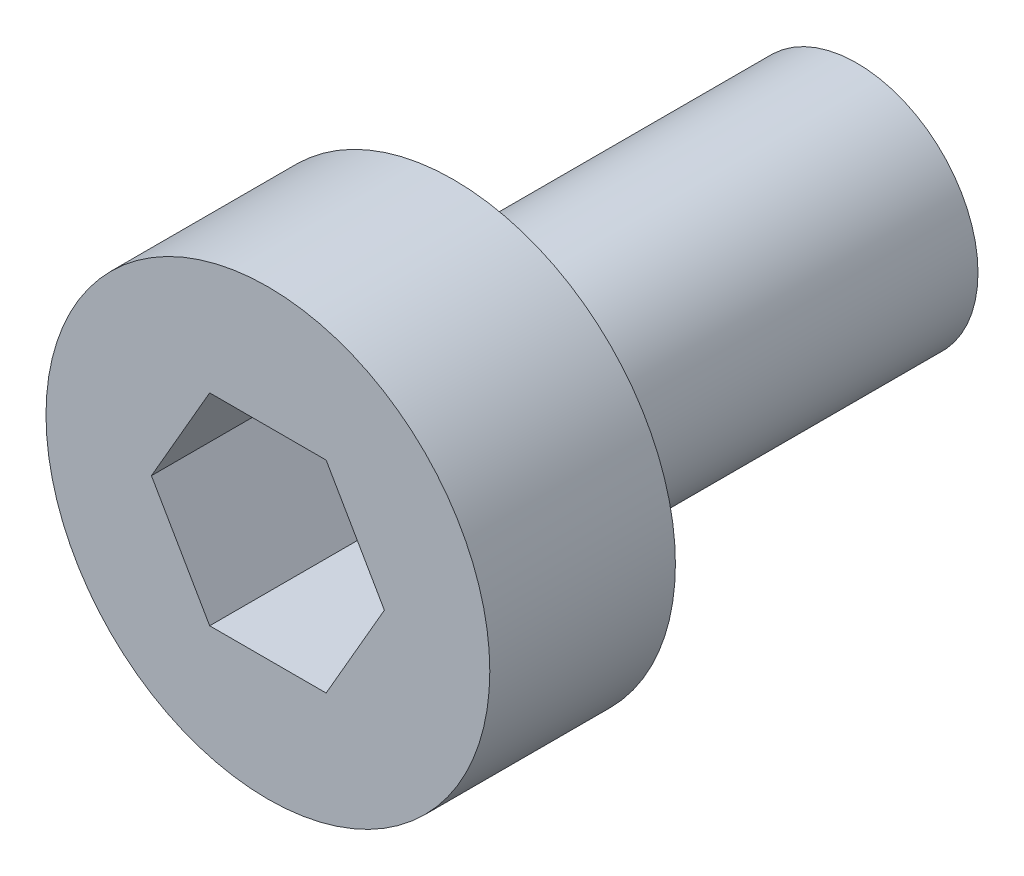
ISO-10303-21;
HEADER;
FILE_DESCRIPTION(('STEP AP214'),'2;1');
FILE_NAME('part.step','',(''),(''),'','','');
FILE_SCHEMA(('AUTOMOTIVE_DESIGN { 1 0 10303 214 1 1 1 1 }'));
ENDSEC;
DATA;
#1=APPLICATION_CONTEXT('core data for automotive mechanical design processes');
#2=APPLICATION_PROTOCOL_DEFINITION('international standard','automotive_design',2000,#1);
#3=PRODUCT_CONTEXT('',#1,'mechanical');
#4=PRODUCT('Part','Part','',(#3));
#5=PRODUCT_RELATED_PRODUCT_CATEGORY('part','',(#4));
#6=PRODUCT_DEFINITION_FORMATION('','',#4);
#7=PRODUCT_DEFINITION_CONTEXT('part definition',#1,'design');
#8=PRODUCT_DEFINITION('design','',#6,#7);
#9=PRODUCT_DEFINITION_SHAPE('','',#8);
#10=(LENGTH_UNIT() NAMED_UNIT(*) SI_UNIT(.MILLI.,.METRE.));
#11=(NAMED_UNIT(*) PLANE_ANGLE_UNIT() SI_UNIT($,.RADIAN.));
#12=(NAMED_UNIT(*) SI_UNIT($,.STERADIAN.) SOLID_ANGLE_UNIT());
#13=UNCERTAINTY_MEASURE_WITH_UNIT(LENGTH_MEASURE(1.E-05),#10,'distance_accuracy_value','');
#14=(GEOMETRIC_REPRESENTATION_CONTEXT(3) GLOBAL_UNCERTAINTY_ASSIGNED_CONTEXT((#13)) GLOBAL_UNIT_ASSIGNED_CONTEXT((#10,
#11,#12)) REPRESENTATION_CONTEXT('',''));
#15=CARTESIAN_POINT('',(0.,0.,0.));
#16=DIRECTION('',(0.,0.,1.));
#17=DIRECTION('',(1.,0.,0.));
#18=AXIS2_PLACEMENT_3D('',#15,#16,#17);
#19=CARTESIAN_POINT('',(0.,0.,5.));
#20=DIRECTION('',(0.,0.,-1.));
#21=DIRECTION('',(-1.,0.,0.));
#22=AXIS2_PLACEMENT_3D('',#19,#20,#21);
#23=CYLINDRICAL_SURFACE('',#22,1.5);
#24=CARTESIAN_POINT('',(0.,0.,5.));
#25=DIRECTION('',(0.,0.,1.));
#26=DIRECTION('',(1.,0.,0.));
#27=AXIS2_PLACEMENT_3D('',#24,#25,#26);
#28=CIRCLE('',#27,1.5);
#29=CARTESIAN_POINT('',(1.5,0.,5.));
#30=VERTEX_POINT('',#29);
#31=EDGE_CURVE('E11',#30,#30,#28,.T.);
#32=ORIENTED_EDGE('',*,*,#31,.F.);
#33=EDGE_LOOP('',(#32));
#34=FACE_BOUND('',#33,.T.);
#35=CARTESIAN_POINT('',(0.,0.,0.));
#36=DIRECTION('',(0.,0.,1.));
#37=DIRECTION('',(1.,0.,0.));
#38=AXIS2_PLACEMENT_3D('',#35,#36,#37);
#39=CIRCLE('',#38,1.5);
#40=CARTESIAN_POINT('',(1.5,0.,0.));
#41=VERTEX_POINT('',#40);
#42=EDGE_CURVE('E37',#41,#41,#39,.T.);
#43=ORIENTED_EDGE('',*,*,#42,.T.);
#44=EDGE_LOOP('',(#43));
#45=FACE_BOUND('',#44,.T.);
#46=ADVANCED_FACE('F34',(#34,#45),#23,.T.);
#47=CARTESIAN_POINT('',(0.,0.,0.));
#48=DIRECTION('',(0.,0.,1.));
#49=DIRECTION('',(1.,0.,0.));
#50=AXIS2_PLACEMENT_3D('',#47,#48,#49);
#51=PLANE('',#50);
#52=ORIENTED_EDGE('',*,*,#42,.F.);
#53=EDGE_LOOP('',(#52));
#54=FACE_BOUND('',#53,.T.);
#55=ADVANCED_FACE('F165',(#54),#51,.F.);
#56=CARTESIAN_POINT('',(0.,0.,7.3));
#57=DIRECTION('',(0.,0.,-1.));
#58=DIRECTION('',(-1.,0.,0.));
#59=AXIS2_PLACEMENT_3D('',#56,#57,#58);
#60=CYLINDRICAL_SURFACE('',#59,2.75);
#61=CARTESIAN_POINT('',(0.,0.,7.3));
#62=DIRECTION('',(0.,0.,1.));
#63=DIRECTION('',(1.,0.,0.));
#64=AXIS2_PLACEMENT_3D('',#61,#62,#63);
#65=CIRCLE('',#64,2.75);
#66=CARTESIAN_POINT('',(2.75,0.,7.3));
#67=VERTEX_POINT('',#66);
#68=EDGE_CURVE('E141',#67,#67,#65,.T.);
#69=ORIENTED_EDGE('',*,*,#68,.F.);
#70=EDGE_LOOP('',(#69));
#71=FACE_BOUND('',#70,.T.);
#72=CARTESIAN_POINT('',(0.,0.,5.));
#73=DIRECTION('',(0.,0.,1.));
#74=DIRECTION('',(1.,0.,0.));
#75=AXIS2_PLACEMENT_3D('',#72,#73,#74);
#76=CIRCLE('',#75,2.75);
#77=CARTESIAN_POINT('',(2.75,0.,5.));
#78=VERTEX_POINT('',#77);
#79=EDGE_CURVE('E135',#78,#78,#76,.T.);
#80=ORIENTED_EDGE('',*,*,#79,.T.);
#81=EDGE_LOOP('',(#80));
#82=FACE_BOUND('',#81,.T.);
#83=ADVANCED_FACE('F147',(#71,#82),#60,.T.);
#84=CARTESIAN_POINT('',(0.,0.,7.3));
#85=DIRECTION('',(0.,0.,1.));
#86=DIRECTION('',(1.,0.,0.));
#87=AXIS2_PLACEMENT_3D('',#84,#85,#86);
#88=PLANE('',#87);
#89=DIRECTION('',(0.5,0.866025403784439,0.));
#90=VECTOR('',#89,1.);
#91=CARTESIAN_POINT('',(0.721687836487032,-1.25,7.3));
#92=LINE('',#91,#90);
#93=CARTESIAN_POINT('',(0.721687836487032,-1.25,7.3));
#94=VERTEX_POINT('',#93);
#95=CARTESIAN_POINT('',(1.44337567297406,0.,7.3));
#96=VERTEX_POINT('',#95);
#97=EDGE_CURVE('E48',#94,#96,#92,.T.);
#98=ORIENTED_EDGE('',*,*,#97,.F.);
#99=DIRECTION('',(1.,0.,0.));
#100=VECTOR('',#99,1.);
#101=CARTESIAN_POINT('',(-0.721687836487033,-1.25,7.3));
#102=LINE('',#101,#100);
#103=CARTESIAN_POINT('',(-0.721687836487033,-1.25,7.3));
#104=VERTEX_POINT('',#103);
#105=EDGE_CURVE('E131',#104,#94,#102,.T.);
#106=ORIENTED_EDGE('',*,*,#105,.F.);
#107=DIRECTION('',(0.5,-0.866025403784439,0.));
#108=VECTOR('',#107,1.);
#109=CARTESIAN_POINT('',(-1.44337567297407,0.,7.3));
#110=LINE('',#109,#108);
#111=CARTESIAN_POINT('',(-1.44337567297407,0.,7.3));
#112=VERTEX_POINT('',#111);
#113=EDGE_CURVE('E129',#112,#104,#110,.T.);
#114=ORIENTED_EDGE('',*,*,#113,.F.);
#115=DIRECTION('',(-0.5,-0.866025403784439,0.));
#116=VECTOR('',#115,1.);
#117=CARTESIAN_POINT('',(-0.721687836487033,1.25,7.3));
#118=LINE('',#117,#116);
#119=CARTESIAN_POINT('',(-0.721687836487033,1.25,7.3));
#120=VERTEX_POINT('',#119);
#121=EDGE_CURVE('E96',#120,#112,#118,.T.);
#122=ORIENTED_EDGE('',*,*,#121,.F.);
#123=DIRECTION('',(-1.,0.,0.));
#124=VECTOR('',#123,1.);
#125=CARTESIAN_POINT('',(0.721687836487032,1.25,7.3));
#126=LINE('',#125,#124);
#127=CARTESIAN_POINT('',(0.721687836487032,1.25,7.3));
#128=VERTEX_POINT('',#127);
#129=EDGE_CURVE('E125',#128,#120,#126,.T.);
#130=ORIENTED_EDGE('',*,*,#129,.F.);
#131=DIRECTION('',(-0.5,0.866025403784439,0.));
#132=VECTOR('',#131,1.);
#133=CARTESIAN_POINT('',(1.44337567297406,0.,7.3));
#134=LINE('',#133,#132);
#135=EDGE_CURVE('E122',#96,#128,#134,.T.);
#136=ORIENTED_EDGE('',*,*,#135,.F.);
#137=EDGE_LOOP('',(#98,#106,#114,#122,#130,#136));
#138=FACE_BOUND('',#137,.T.);
#139=ORIENTED_EDGE('',*,*,#68,.T.);
#140=EDGE_LOOP('',(#139));
#141=FACE_BOUND('',#140,.T.);
#142=ADVANCED_FACE('F152',(#138,#141),#88,.T.);
#143=CARTESIAN_POINT('',(0.,0.,5.));
#144=DIRECTION('',(0.,0.,1.));
#145=DIRECTION('',(1.,0.,0.));
#146=AXIS2_PLACEMENT_3D('',#143,#144,#145);
#147=PLANE('',#146);
#148=ORIENTED_EDGE('',*,*,#31,.T.);
#149=EDGE_LOOP('',(#148));
#150=FACE_BOUND('',#149,.T.);
#151=ORIENTED_EDGE('',*,*,#79,.F.);
#152=EDGE_LOOP('',(#151));
#153=FACE_BOUND('',#152,.T.);
#154=ADVANCED_FACE('F149',(#150,#153),#147,.F.);
#155=CARTESIAN_POINT('',(0.721687836487032,-1.25,5.3));
#156=DIRECTION('',(0.866025403784439,-0.5,0.));
#157=DIRECTION('',(0.5,0.866025403784439,0.));
#158=AXIS2_PLACEMENT_3D('',#155,#156,#157);
#159=PLANE('',#158);
#160=ORIENTED_EDGE('',*,*,#97,.T.);
#161=DIRECTION('',(0.,0.,1.));
#162=VECTOR('',#161,1.);
#163=CARTESIAN_POINT('',(1.44337567297406,0.,5.3));
#164=LINE('',#163,#162);
#165=CARTESIAN_POINT('',(1.44337567297406,0.,5.3));
#166=VERTEX_POINT('',#165);
#167=EDGE_CURVE('E78',#166,#96,#164,.T.);
#168=ORIENTED_EDGE('',*,*,#167,.F.);
#169=DIRECTION('',(0.5,0.866025403784439,0.));
#170=VECTOR('',#169,1.);
#171=CARTESIAN_POINT('',(0.721687836487032,-1.25,5.3));
#172=LINE('',#171,#170);
#173=CARTESIAN_POINT('',(0.721687836487032,-1.25,5.3));
#174=VERTEX_POINT('',#173);
#175=EDGE_CURVE('E133',#174,#166,#172,.T.);
#176=ORIENTED_EDGE('',*,*,#175,.F.);
#177=DIRECTION('',(0.,0.,1.));
#178=VECTOR('',#177,1.);
#179=CARTESIAN_POINT('',(0.721687836487032,-1.25,5.3));
#180=LINE('',#179,#178);
#181=EDGE_CURVE('E56',#174,#94,#180,.T.);
#182=ORIENTED_EDGE('',*,*,#181,.T.);
#183=EDGE_LOOP('',(#160,#168,#176,#182));
#184=FACE_BOUND('',#183,.T.);
#185=ADVANCED_FACE('F151',(#184),#159,.F.);
#186=CARTESIAN_POINT('',(-0.721687836487033,-1.25,5.3));
#187=DIRECTION('',(0.,-1.,0.));
#188=DIRECTION('',(1.,0.,0.));
#189=AXIS2_PLACEMENT_3D('',#186,#187,#188);
#190=PLANE('',#189);
#191=ORIENTED_EDGE('',*,*,#105,.T.);
#192=ORIENTED_EDGE('',*,*,#181,.F.);
#193=DIRECTION('',(1.,0.,0.));
#194=VECTOR('',#193,1.);
#195=CARTESIAN_POINT('',(-0.721687836487033,-1.25,5.3));
#196=LINE('',#195,#194);
#197=CARTESIAN_POINT('',(-0.721687836487033,-1.25,5.3));
#198=VERTEX_POINT('',#197);
#199=EDGE_CURVE('E108',#198,#174,#196,.T.);
#200=ORIENTED_EDGE('',*,*,#199,.F.);
#201=DIRECTION('',(0.,0.,1.));
#202=VECTOR('',#201,1.);
#203=CARTESIAN_POINT('',(-0.721687836487033,-1.25,5.3));
#204=LINE('',#203,#202);
#205=EDGE_CURVE('E100',#198,#104,#204,.T.);
#206=ORIENTED_EDGE('',*,*,#205,.T.);
#207=EDGE_LOOP('',(#191,#192,#200,#206));
#208=FACE_BOUND('',#207,.T.);
#209=ADVANCED_FACE('F159',(#208),#190,.F.);
#210=CARTESIAN_POINT('',(-1.44337567297407,0.,5.3));
#211=DIRECTION('',(-0.866025403784439,-0.5,0.));
#212=DIRECTION('',(0.5,-0.866025403784439,0.));
#213=AXIS2_PLACEMENT_3D('',#210,#211,#212);
#214=PLANE('',#213);
#215=ORIENTED_EDGE('',*,*,#113,.T.);
#216=ORIENTED_EDGE('',*,*,#205,.F.);
#217=DIRECTION('',(0.5,-0.866025403784439,0.));
#218=VECTOR('',#217,1.);
#219=CARTESIAN_POINT('',(-1.44337567297407,0.,5.3));
#220=LINE('',#219,#218);
#221=CARTESIAN_POINT('',(-1.44337567297407,0.,5.3));
#222=VERTEX_POINT('',#221);
#223=EDGE_CURVE('E104',#222,#198,#220,.T.);
#224=ORIENTED_EDGE('',*,*,#223,.F.);
#225=DIRECTION('',(0.,0.,1.));
#226=VECTOR('',#225,1.);
#227=CARTESIAN_POINT('',(-1.44337567297407,0.,5.3));
#228=LINE('',#227,#226);
#229=EDGE_CURVE('E89',#222,#112,#228,.T.);
#230=ORIENTED_EDGE('',*,*,#229,.T.);
#231=EDGE_LOOP('',(#215,#216,#224,#230));
#232=FACE_BOUND('',#231,.T.);
#233=ADVANCED_FACE('F105',(#232),#214,.F.);
#234=CARTESIAN_POINT('',(-0.721687836487033,1.25,5.3));
#235=DIRECTION('',(-0.866025403784439,0.5,0.));
#236=DIRECTION('',(-0.5,-0.866025403784439,0.));
#237=AXIS2_PLACEMENT_3D('',#234,#235,#236);
#238=PLANE('',#237);
#239=ORIENTED_EDGE('',*,*,#121,.T.);
#240=ORIENTED_EDGE('',*,*,#229,.F.);
#241=DIRECTION('',(-0.5,-0.866025403784439,0.));
#242=VECTOR('',#241,1.);
#243=CARTESIAN_POINT('',(-0.721687836487033,1.25,5.3));
#244=LINE('',#243,#242);
#245=CARTESIAN_POINT('',(-0.721687836487033,1.25,5.3));
#246=VERTEX_POINT('',#245);
#247=EDGE_CURVE('E93',#246,#222,#244,.T.);
#248=ORIENTED_EDGE('',*,*,#247,.F.);
#249=DIRECTION('',(0.,0.,1.));
#250=VECTOR('',#249,1.);
#251=CARTESIAN_POINT('',(-0.721687836487033,1.25,5.3));
#252=LINE('',#251,#250);
#253=EDGE_CURVE('E101',#246,#120,#252,.T.);
#254=ORIENTED_EDGE('',*,*,#253,.T.);
#255=EDGE_LOOP('',(#239,#240,#248,#254));
#256=FACE_BOUND('',#255,.T.);
#257=ADVANCED_FACE('F91',(#256),#238,.F.);
#258=CARTESIAN_POINT('',(0.721687836487032,1.25,5.3));
#259=DIRECTION('',(0.,1.,0.));
#260=DIRECTION('',(0.,0.,1.));
#261=AXIS2_PLACEMENT_3D('',#258,#259,#260);
#262=PLANE('',#261);
#263=ORIENTED_EDGE('',*,*,#129,.T.);
#264=ORIENTED_EDGE('',*,*,#253,.F.);
#265=DIRECTION('',(-1.,0.,0.));
#266=VECTOR('',#265,1.);
#267=CARTESIAN_POINT('',(0.721687836487032,1.25,5.3));
#268=LINE('',#267,#266);
#269=CARTESIAN_POINT('',(0.721687836487032,1.25,5.3));
#270=VERTEX_POINT('',#269);
#271=EDGE_CURVE('E114',#270,#246,#268,.T.);
#272=ORIENTED_EDGE('',*,*,#271,.F.);
#273=DIRECTION('',(0.,0.,1.));
#274=VECTOR('',#273,1.);
#275=CARTESIAN_POINT('',(0.721687836487032,1.25,5.3));
#276=LINE('',#275,#274);
#277=EDGE_CURVE('E138',#270,#128,#276,.T.);
#278=ORIENTED_EDGE('',*,*,#277,.T.);
#279=EDGE_LOOP('',(#263,#264,#272,#278));
#280=FACE_BOUND('',#279,.T.);
#281=ADVANCED_FACE('F220',(#280),#262,.F.);
#282=CARTESIAN_POINT('',(1.44337567297406,0.,5.3));
#283=DIRECTION('',(0.866025403784439,0.5,0.));
#284=DIRECTION('',(-0.5,0.866025403784439,0.));
#285=AXIS2_PLACEMENT_3D('',#282,#283,#284);
#286=PLANE('',#285);
#287=ORIENTED_EDGE('',*,*,#135,.T.);
#288=ORIENTED_EDGE('',*,*,#277,.F.);
#289=DIRECTION('',(-0.5,0.866025403784439,0.));
#290=VECTOR('',#289,1.);
#291=CARTESIAN_POINT('',(1.44337567297406,0.,5.3));
#292=LINE('',#291,#290);
#293=EDGE_CURVE('E116',#166,#270,#292,.T.);
#294=ORIENTED_EDGE('',*,*,#293,.F.);
#295=ORIENTED_EDGE('',*,*,#167,.T.);
#296=EDGE_LOOP('',(#287,#288,#294,#295));
#297=FACE_BOUND('',#296,.T.);
#298=ADVANCED_FACE('F229',(#297),#286,.F.);
#299=CARTESIAN_POINT('',(0.,0.,5.3));
#300=DIRECTION('',(0.,0.,1.));
#301=DIRECTION('',(1.,0.,0.));
#302=AXIS2_PLACEMENT_3D('',#299,#300,#301);
#303=PLANE('',#302);
#304=ORIENTED_EDGE('',*,*,#175,.T.);
#305=ORIENTED_EDGE('',*,*,#293,.T.);
#306=ORIENTED_EDGE('',*,*,#271,.T.);
#307=ORIENTED_EDGE('',*,*,#247,.T.);
#308=ORIENTED_EDGE('',*,*,#223,.T.);
#309=ORIENTED_EDGE('',*,*,#199,.T.);
#310=EDGE_LOOP('',(#304,#305,#306,#307,#308,#309));
#311=FACE_BOUND('',#310,.T.);
#312=ADVANCED_FACE('F111',(#311),#303,.T.);
#313=CLOSED_SHELL('',(#46,#55,#83,#142,#154,#185,#209,#233,#257,#281,#298,#312));
#314=MANIFOLD_SOLID_BREP('B2',#313);
#315=ADVANCED_BREP_SHAPE_REPRESENTATION('',(#18,#314),#14);
#316=SHAPE_DEFINITION_REPRESENTATION(#9,#315);
ENDSEC;
END-ISO-10303-21;
